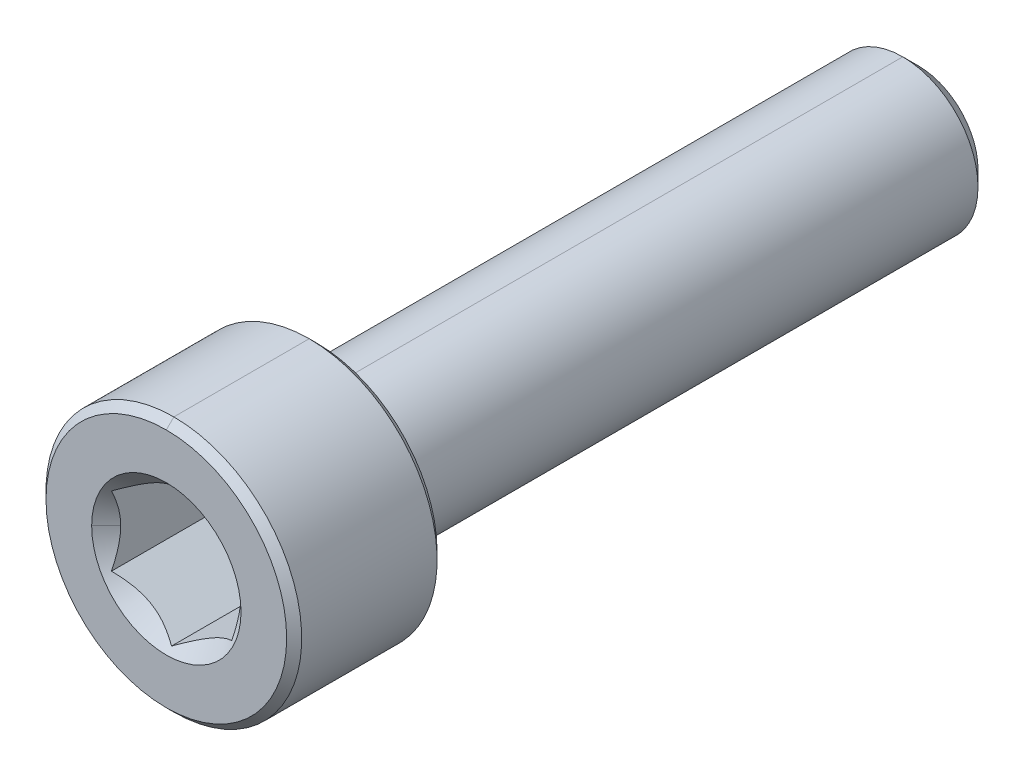
ISO-10303-21;
HEADER;
FILE_DESCRIPTION(('STEP AP214'),'2;1');
FILE_NAME('part.step','',(''),(''),'','','');
FILE_SCHEMA(('AUTOMOTIVE_DESIGN { 1 0 10303 214 1 1 1 1 }'));
ENDSEC;
DATA;
#1=APPLICATION_CONTEXT('core data for automotive mechanical design processes');
#2=APPLICATION_PROTOCOL_DEFINITION('international standard','automotive_design',2000,#1);
#3=PRODUCT_CONTEXT('',#1,'mechanical');
#4=PRODUCT('Part','Part','',(#3));
#5=PRODUCT_RELATED_PRODUCT_CATEGORY('part','',(#4));
#6=PRODUCT_DEFINITION_FORMATION('','',#4);
#7=PRODUCT_DEFINITION_CONTEXT('part definition',#1,'design');
#8=PRODUCT_DEFINITION('design','',#6,#7);
#9=PRODUCT_DEFINITION_SHAPE('','',#8);
#10=(LENGTH_UNIT() NAMED_UNIT(*) SI_UNIT(.MILLI.,.METRE.));
#11=(NAMED_UNIT(*) PLANE_ANGLE_UNIT() SI_UNIT($,.RADIAN.));
#12=(NAMED_UNIT(*) SI_UNIT($,.STERADIAN.) SOLID_ANGLE_UNIT());
#13=UNCERTAINTY_MEASURE_WITH_UNIT(LENGTH_MEASURE(1.E-05),#10,'distance_accuracy_value','');
#14=(GEOMETRIC_REPRESENTATION_CONTEXT(3) GLOBAL_UNCERTAINTY_ASSIGNED_CONTEXT((#13)) GLOBAL_UNIT_ASSIGNED_CONTEXT((#10,
#11,#12)) REPRESENTATION_CONTEXT('',''));
#15=CARTESIAN_POINT('',(0.,0.,0.));
#16=DIRECTION('',(0.,0.,1.));
#17=DIRECTION('',(1.,0.,0.));
#18=AXIS2_PLACEMENT_3D('',#15,#16,#17);
#19=CARTESIAN_POINT('',(2.,-1.15470053837925,1.38989907339221));
#20=DIRECTION('',(1.,0.,0.));
#21=DIRECTION('',(0.,1.,0.));
#22=AXIS2_PLACEMENT_3D('',#19,#20,#21);
#23=PLANE('',#22);
#24=DIRECTION('',(0.,0.,1.));
#25=VECTOR('',#24,1.);
#26=CARTESIAN_POINT('',(2.,-1.15470053837925,1.38989907339221));
#27=LINE('',#26,#25);
#28=CARTESIAN_POINT('',(2.,-1.15470053837925,8.5));
#29=VERTEX_POINT('',#28);
#30=CARTESIAN_POINT('',(2.,-1.15470053837925,12.3267949192431));
#31=VERTEX_POINT('',#30);
#32=EDGE_CURVE('E279',#29,#31,#27,.T.);
#33=ORIENTED_EDGE('',*,*,#32,.T.);
#34=CARTESIAN_POINT('',(2.,-1.15470053837925,12.3267949192431));
#35=CARTESIAN_POINT('',(2.,-0.860711468066337,12.1798003840866));
#36=CARTESIAN_POINT('',(2.,-0.594553501558203,12.1038966261432));
#37=CARTESIAN_POINT('',(2.,-0.291229850402118,12.0173938424846));
#38=CARTESIAN_POINT('',(2.,0.,12.0173938424846));
#39=B_SPLINE_CURVE_WITH_KNOTS('',2,(#34,#35,#36,#37,#38),.UNSPECIFIED.,.F.,.F.,(3,2,3),(0.,0.5,
1.),.UNSPECIFIED.);
#40=CARTESIAN_POINT('',(2.,0.,12.0173938424846));
#41=VERTEX_POINT('',#40);
#42=EDGE_CURVE('E332',#31,#41,#39,.T.);
#43=ORIENTED_EDGE('',*,*,#42,.T.);
#44=CARTESIAN_POINT('',(2.,0.,12.0173938424846));
#45=CARTESIAN_POINT('',(2.,0.2906347536431,12.0173938424846));
#46=CARTESIAN_POINT('',(2.,0.59433789161311,12.1038351978567));
#47=CARTESIAN_POINT('',(2.,0.860020865665505,12.1794550828862));
#48=CARTESIAN_POINT('',(2.,1.15470053837926,12.3267949192431));
#49=B_SPLINE_CURVE_WITH_KNOTS('',2,(#44,#45,#46,#47,#48),.UNSPECIFIED.,.F.,.F.,(3,2,3),(0.,0.5,
1.),.UNSPECIFIED.);
#50=CARTESIAN_POINT('',(2.,1.15470053837925,12.3267949192431));
#51=VERTEX_POINT('',#50);
#52=EDGE_CURVE('E342',#41,#51,#49,.T.);
#53=ORIENTED_EDGE('',*,*,#52,.T.);
#54=DIRECTION('',(0.,0.,1.));
#55=VECTOR('',#54,1.);
#56=CARTESIAN_POINT('',(2.,1.15470053837925,1.38989907339221));
#57=LINE('',#56,#55);
#58=CARTESIAN_POINT('',(2.,1.15470053837925,8.5));
#59=VERTEX_POINT('',#58);
#60=EDGE_CURVE('E10',#59,#51,#57,.T.);
#61=ORIENTED_EDGE('',*,*,#60,.F.);
#62=DIRECTION('',(0.,1.,0.));
#63=VECTOR('',#62,1.);
#64=CARTESIAN_POINT('',(2.,-1.15470053837925,8.5));
#65=LINE('',#64,#63);
#66=EDGE_CURVE('E336',#29,#59,#65,.T.);
#67=ORIENTED_EDGE('',*,*,#66,.F.);
#68=EDGE_LOOP('',(#33,#43,#53,#61,#67));
#69=FACE_BOUND('',#68,.T.);
#70=ADVANCED_FACE('F16',(#69),#23,.F.);
#71=CARTESIAN_POINT('',(2.,1.15470053837925,1.38989907339221));
#72=DIRECTION('',(0.5,0.866025403784439,0.));
#73=DIRECTION('',(0.,0.,-1.));
#74=AXIS2_PLACEMENT_3D('',#71,#72,#73);
#75=PLANE('',#74);
#76=ORIENTED_EDGE('',*,*,#60,.T.);
#77=CARTESIAN_POINT('',(2.,1.15470053837925,12.3267949192431));
#78=CARTESIAN_POINT('',(1.74731844122738,1.30058630435588,12.1809091532665));
#79=CARTESIAN_POINT('',(1.51844238813641,1.43272795521901,12.1050663933784));
#80=CARTESIAN_POINT('',(1.2559956895848,1.58425162727571,12.0180993137174));
#81=CARTESIAN_POINT('',(1.00368304019056,1.72992440332342,12.0173983640745));
#82=CARTESIAN_POINT('',(0.75182144825299,1.87533676122711,12.016698667514));
#83=CARTESIAN_POINT('',(0.488251463553495,2.02750896284366,12.1028631148724));
#84=CARTESIAN_POINT('',(0.256815050186904,2.16112883840115,12.178522680885));
#85=CARTESIAN_POINT('',(0.,2.3094010767585,12.3267949192431));
#86=B_SPLINE_CURVE_WITH_KNOTS('',2,(#77,#78,#79,#80,#81,#82,#83,#84,#85),.UNSPECIFIED.,.F.,.F.,
(3,2,2,2,3),(0.,0.25,0.5,0.75,1.),.UNSPECIFIED.);
#87=CARTESIAN_POINT('',(0.,2.30940107675851,12.3267949192431));
#88=VERTEX_POINT('',#87);
#89=EDGE_CURVE('E352',#51,#88,#86,.T.);
#90=ORIENTED_EDGE('',*,*,#89,.T.);
#91=DIRECTION('',(0.,0.,1.));
#92=VECTOR('',#91,1.);
#93=CARTESIAN_POINT('',(0.,2.30940107675851,1.38989907339221));
#94=LINE('',#93,#92);
#95=CARTESIAN_POINT('',(0.,2.30940107675851,8.5));
#96=VERTEX_POINT('',#95);
#97=EDGE_CURVE('E28',#96,#88,#94,.T.);
#98=ORIENTED_EDGE('',*,*,#97,.F.);
#99=DIRECTION('',(-0.866025403784439,0.5,0.));
#100=VECTOR('',#99,1.);
#101=CARTESIAN_POINT('',(2.,1.15470053837925,8.5));
#102=LINE('',#101,#100);
#103=EDGE_CURVE('E349',#59,#96,#102,.T.);
#104=ORIENTED_EDGE('',*,*,#103,.F.);
#105=EDGE_LOOP('',(#76,#90,#98,#104));
#106=FACE_BOUND('',#105,.T.);
#107=ADVANCED_FACE('F323',(#106),#75,.F.);
#108=CARTESIAN_POINT('',(0.,2.30940107675851,1.38989907339221));
#109=DIRECTION('',(-0.5,0.866025403784439,0.));
#110=DIRECTION('',(0.,0.,1.));
#111=AXIS2_PLACEMENT_3D('',#108,#109,#110);
#112=PLANE('',#111);
#113=ORIENTED_EDGE('',*,*,#97,.T.);
#114=CARTESIAN_POINT('',(0.,2.30940107675851,12.3267949192431));
#115=CARTESIAN_POINT('',(-0.252681558774491,2.1635153107808,12.1809091532654));
#116=CARTESIAN_POINT('',(-0.481557611863588,2.03137365991875,12.1050663933784));
#117=CARTESIAN_POINT('',(-0.744004310419591,1.87984998785951,12.0180993137164));
#118=CARTESIAN_POINT('',(-0.996316959809438,1.73417721181434,12.0173983640745));
#119=CARTESIAN_POINT('',(-1.24817855175139,1.58876485390813,12.016698667515));
#120=CARTESIAN_POINT('',(-1.51174853644651,1.43659265229409,12.1028631148724));
#121=CARTESIAN_POINT('',(-1.74318494981484,1.3029727767356,12.1785226808861));
#122=CARTESIAN_POINT('',(-2.,1.15470053837925,12.3267949192431));
#123=B_SPLINE_CURVE_WITH_KNOTS('',2,(#114,#115,#116,#117,#118,#119,#120,#121,#122),
.UNSPECIFIED.,.F.,.F.,(3,2,2,2,3),(0.,0.25,0.5,0.75,1.),.UNSPECIFIED.);
#124=CARTESIAN_POINT('',(-2.,1.15470053837925,12.3267949192431));
#125=VERTEX_POINT('',#124);
#126=EDGE_CURVE('E184',#88,#125,#123,.T.);
#127=ORIENTED_EDGE('',*,*,#126,.T.);
#128=DIRECTION('',(0.,0.,1.));
#129=VECTOR('',#128,1.);
#130=CARTESIAN_POINT('',(-2.,1.15470053837925,1.38989907339221));
#131=LINE('',#130,#129);
#132=CARTESIAN_POINT('',(-2.,1.15470053837925,8.5));
#133=VERTEX_POINT('',#132);
#134=EDGE_CURVE('E53',#133,#125,#131,.T.);
#135=ORIENTED_EDGE('',*,*,#134,.F.);
#136=DIRECTION('',(-0.866025403784439,-0.5,0.));
#137=VECTOR('',#136,1.);
#138=CARTESIAN_POINT('',(0.,2.30940107675851,8.5));
#139=LINE('',#138,#137);
#140=EDGE_CURVE('E402',#96,#133,#139,.T.);
#141=ORIENTED_EDGE('',*,*,#140,.F.);
#142=EDGE_LOOP('',(#113,#127,#135,#141));
#143=FACE_BOUND('',#142,.T.);
#144=ADVANCED_FACE('F220',(#143),#112,.F.);
#145=CARTESIAN_POINT('',(-2.,1.15470053837925,1.38989907339221));
#146=DIRECTION('',(-1.,0.,0.));
#147=DIRECTION('',(0.,1.,0.));
#148=AXIS2_PLACEMENT_3D('',#145,#146,#147);
#149=PLANE('',#148);
#150=ORIENTED_EDGE('',*,*,#134,.T.);
#151=CARTESIAN_POINT('',(-2.,1.15470053837925,12.3267949192431));
#152=CARTESIAN_POINT('',(-2.,0.860594448234704,12.1797418741708));
#153=CARTESIAN_POINT('',(-2.,0.594337891613108,12.1038351978567));
#154=CARTESIAN_POINT('',(-2.,0.29112902055344,12.0173938424846));
#155=CARTESIAN_POINT('',(-2.,0.,12.0173938424846));
#156=B_SPLINE_CURVE_WITH_KNOTS('',2,(#151,#152,#153,#154,#155),.UNSPECIFIED.,.F.,.F.,(3,2,3),
(0.,0.5,1.),.UNSPECIFIED.);
#157=CARTESIAN_POINT('',(-2.,0.,12.0173938424846));
#158=VERTEX_POINT('',#157);
#159=EDGE_CURVE('E173',#125,#158,#156,.T.);
#160=ORIENTED_EDGE('',*,*,#159,.T.);
#161=CARTESIAN_POINT('',(-2.,0.,12.0173938424846));
#162=CARTESIAN_POINT('',(-2.,-0.290734141218018,12.0173938424846));
#163=CARTESIAN_POINT('',(-2.,-0.594553501558203,12.1038966261432));
#164=CARTESIAN_POINT('',(-2.,-0.860136204723693,12.1795127524153));
#165=CARTESIAN_POINT('',(-2.,-1.15470053837925,12.3267949192431));
#166=B_SPLINE_CURVE_WITH_KNOTS('',2,(#161,#162,#163,#164,#165),.UNSPECIFIED.,.F.,.F.,(3,2,3),
(0.,0.5,1.),.UNSPECIFIED.);
#167=CARTESIAN_POINT('',(-2.,-1.15470053837925,12.3267949192431));
#168=VERTEX_POINT('',#167);
#169=EDGE_CURVE('E178',#158,#168,#166,.T.);
#170=ORIENTED_EDGE('',*,*,#169,.T.);
#171=DIRECTION('',(0.,0.,1.));
#172=VECTOR('',#171,1.);
#173=CARTESIAN_POINT('',(-2.,-1.15470053837925,1.38989907339221));
#174=LINE('',#173,#172);
#175=CARTESIAN_POINT('',(-2.,-1.15470053837925,8.5));
#176=VERTEX_POINT('',#175);
#177=EDGE_CURVE('E42',#176,#168,#174,.T.);
#178=ORIENTED_EDGE('',*,*,#177,.F.);
#179=DIRECTION('',(0.,-1.,0.));
#180=VECTOR('',#179,1.);
#181=CARTESIAN_POINT('',(-2.,1.15470053837925,8.5));
#182=LINE('',#181,#180);
#183=EDGE_CURVE('E406',#133,#176,#182,.T.);
#184=ORIENTED_EDGE('',*,*,#183,.F.);
#185=EDGE_LOOP('',(#150,#160,#170,#178,#184));
#186=FACE_BOUND('',#185,.T.);
#187=ADVANCED_FACE('F176',(#186),#149,.F.);
#188=CARTESIAN_POINT('',(-2.,-1.15470053837925,1.38989907339221));
#189=DIRECTION('',(-0.5,-0.866025403784439,0.));
#190=DIRECTION('',(-0.866025403784439,0.5,0.));
#191=AXIS2_PLACEMENT_3D('',#188,#189,#190);
#192=PLANE('',#191);
#193=ORIENTED_EDGE('',*,*,#177,.T.);
#194=CARTESIAN_POINT('',(-2.,-1.15470053837925,12.3267949192431));
#195=CARTESIAN_POINT('',(-1.7473184412223,-1.30058630435881,12.1809091532636));
#196=CARTESIAN_POINT('',(-1.51844238813641,-1.43272795521901,12.1050663933784));
#197=CARTESIAN_POINT('',(-1.25599568958183,-1.58425162727742,12.0180993137178));
#198=CARTESIAN_POINT('',(-1.00368304019056,-1.72992440332342,12.0173983640745));
#199=CARTESIAN_POINT('',(-0.751821448254411,-1.87533676122629,12.0166986675136));
#200=CARTESIAN_POINT('',(-0.488251463553495,-2.02750896284366,12.1028631148724));
#201=CARTESIAN_POINT('',(-0.256815050186904,-2.16112883840115,12.178522680885));
#202=CARTESIAN_POINT('',(0.,-2.3094010767585,12.3267949192431));
#203=B_SPLINE_CURVE_WITH_KNOTS('',2,(#194,#195,#196,#197,#198,#199,#200,#201,#202),
.UNSPECIFIED.,.F.,.F.,(3,2,2,2,3),(0.,0.25,0.5,0.75,1.),.UNSPECIFIED.);
#204=CARTESIAN_POINT('',(0.,-2.30940107675851,12.3267949192431));
#205=VERTEX_POINT('',#204);
#206=EDGE_CURVE('E202',#168,#205,#203,.T.);
#207=ORIENTED_EDGE('',*,*,#206,.T.);
#208=DIRECTION('',(0.,0.,1.));
#209=VECTOR('',#208,1.);
#210=CARTESIAN_POINT('',(0.,-2.30940107675851,1.38989907339221));
#211=LINE('',#210,#209);
#212=CARTESIAN_POINT('',(0.,-2.30940107675851,8.5));
#213=VERTEX_POINT('',#212);
#214=EDGE_CURVE('E286',#213,#205,#211,.T.);
#215=ORIENTED_EDGE('',*,*,#214,.F.);
#216=DIRECTION('',(0.866025403784439,-0.5,0.));
#217=VECTOR('',#216,1.);
#218=CARTESIAN_POINT('',(-2.,-1.15470053837925,8.5));
#219=LINE('',#218,#217);
#220=EDGE_CURVE('E296',#176,#213,#219,.T.);
#221=ORIENTED_EDGE('',*,*,#220,.F.);
#222=EDGE_LOOP('',(#193,#207,#215,#221));
#223=FACE_BOUND('',#222,.T.);
#224=ADVANCED_FACE('F219',(#223),#192,.F.);
#225=CARTESIAN_POINT('',(0.,-2.30940107675851,1.38989907339221));
#226=DIRECTION('',(0.5,-0.866025403784439,0.));
#227=DIRECTION('',(0.,0.,-1.));
#228=AXIS2_PLACEMENT_3D('',#225,#226,#227);
#229=PLANE('',#228);
#230=ORIENTED_EDGE('',*,*,#214,.T.);
#231=CARTESIAN_POINT('',(0.,-2.30940107675851,12.3267949192431));
#232=CARTESIAN_POINT('',(0.252681558774368,-2.16351531078087,12.1809091532655));
#233=CARTESIAN_POINT('',(0.481557611863587,-2.03137365991875,12.1050663933784));
#234=CARTESIAN_POINT('',(0.744004310419528,-1.87984998785955,12.0180993137164));
#235=CARTESIAN_POINT('',(0.996316959809436,-1.73417721181434,12.0173983640745));
#236=CARTESIAN_POINT('',(1.24817855175601,-1.58876485390546,12.0166986675149));
#237=CARTESIAN_POINT('',(1.51174853644651,-1.43659265229409,12.1028631148724));
#238=CARTESIAN_POINT('',(1.74318494982025,-1.30297277673248,12.1785226808892));
#239=CARTESIAN_POINT('',(2.,-1.15470053837925,12.3267949192431));
#240=B_SPLINE_CURVE_WITH_KNOTS('',2,(#231,#232,#233,#234,#235,#236,#237,#238,#239),
.UNSPECIFIED.,.F.,.F.,(3,2,2,2,3),(0.,0.25,0.5,0.75,1.),.UNSPECIFIED.);
#241=EDGE_CURVE('E302',#205,#31,#240,.T.);
#242=ORIENTED_EDGE('',*,*,#241,.T.);
#243=ORIENTED_EDGE('',*,*,#32,.F.);
#244=DIRECTION('',(0.866025403784439,0.5,0.));
#245=VECTOR('',#244,1.);
#246=CARTESIAN_POINT('',(0.,-2.30940107675851,8.5));
#247=LINE('',#246,#245);
#248=EDGE_CURVE('E339',#213,#29,#247,.T.);
#249=ORIENTED_EDGE('',*,*,#248,.F.);
#250=EDGE_LOOP('',(#230,#242,#243,#249));
#251=FACE_BOUND('',#250,.T.);
#252=ADVANCED_FACE('F308',(#251),#229,.F.);
#253=CARTESIAN_POINT('',(0.,4.,8.5));
#254=DIRECTION('',(0.,0.,-1.));
#255=DIRECTION('',(-1.,0.,0.));
#256=AXIS2_PLACEMENT_3D('',#253,#254,#255);
#257=PLANE('',#256);
#258=ORIENTED_EDGE('',*,*,#248,.T.);
#259=ORIENTED_EDGE('',*,*,#66,.T.);
#260=ORIENTED_EDGE('',*,*,#103,.T.);
#261=ORIENTED_EDGE('',*,*,#140,.T.);
#262=ORIENTED_EDGE('',*,*,#183,.T.);
#263=ORIENTED_EDGE('',*,*,#220,.T.);
#264=EDGE_LOOP('',(#258,#259,#260,#261,#262,#263));
#265=FACE_BOUND('',#264,.T.);
#266=ADVANCED_FACE('F247',(#265),#257,.F.);
#267=CARTESIAN_POINT('',(0.,0.,12.5));
#268=DIRECTION('',(0.,0.,1.));
#269=DIRECTION('',(1.,0.,0.));
#270=AXIS2_PLACEMENT_3D('',#267,#268,#269);
#271=CONICAL_SURFACE('',#270,2.48260615751539,0.78539816339745);
#272=DIRECTION('',(-0.707106781186549,0.,0.707106781186546));
#273=VECTOR('',#272,1.);
#274=CARTESIAN_POINT('',(-2.48260615751539,0.,12.5));
#275=LINE('',#274,#273);
#276=CARTESIAN_POINT('',(-2.48260615751539,0.,12.5));
#277=VERTEX_POINT('',#276);
#278=EDGE_CURVE('E189',#158,#277,#275,.T.);
#279=ORIENTED_EDGE('',*,*,#278,.F.);
#280=ORIENTED_EDGE('',*,*,#159,.F.);
#281=ORIENTED_EDGE('',*,*,#126,.F.);
#282=ORIENTED_EDGE('',*,*,#89,.F.);
#283=ORIENTED_EDGE('',*,*,#52,.F.);
#284=DIRECTION('',(0.707106781186549,0.,0.707106781186546));
#285=VECTOR('',#284,1.);
#286=CARTESIAN_POINT('',(2.48260615751539,0.,12.5));
#287=LINE('',#286,#285);
#288=CARTESIAN_POINT('',(2.48260615751539,0.,12.5));
#289=VERTEX_POINT('',#288);
#290=EDGE_CURVE('E453',#41,#289,#287,.T.);
#291=ORIENTED_EDGE('',*,*,#290,.T.);
#292=CARTESIAN_POINT('',(0.,0.,12.5));
#293=DIRECTION('',(0.,0.,1.));
#294=DIRECTION('',(1.,0.,0.));
#295=AXIS2_PLACEMENT_3D('',#292,#293,#294);
#296=CIRCLE('',#295,2.48260615751539);
#297=EDGE_CURVE('E185',#289,#277,#296,.T.);
#298=ORIENTED_EDGE('',*,*,#297,.T.);
#299=EDGE_LOOP('',(#279,#280,#281,#282,#283,#291,#298));
#300=FACE_BOUND('',#299,.T.);
#301=ADVANCED_FACE('F190',(#300),#271,.F.);
#302=CARTESIAN_POINT('',(0.,0.,12.5));
#303=DIRECTION('',(0.,0.,1.));
#304=DIRECTION('',(0.,-1.,0.));
#305=AXIS2_PLACEMENT_3D('',#302,#303,#304);
#306=PLANE('',#305);
#307=ORIENTED_EDGE('',*,*,#297,.F.);
#308=CARTESIAN_POINT('',(0.,0.,12.5));
#309=DIRECTION('',(0.,0.,1.));
#310=DIRECTION('',(1.,0.,0.));
#311=AXIS2_PLACEMENT_3D('',#308,#309,#310);
#312=CIRCLE('',#311,2.48260615751539);
#313=EDGE_CURVE('E196',#277,#289,#312,.T.);
#314=ORIENTED_EDGE('',*,*,#313,.F.);
#315=EDGE_LOOP('',(#307,#314));
#316=FACE_BOUND('',#315,.T.);
#317=CARTESIAN_POINT('',(0.,0.,12.5));
#318=DIRECTION('',(0.,0.,-1.));
#319=DIRECTION('',(0.,1.,0.));
#320=AXIS2_PLACEMENT_3D('',#317,#318,#319);
#321=CIRCLE('',#320,4.);
#322=CARTESIAN_POINT('',(0.,4.,12.5));
#323=VERTEX_POINT('',#322);
#324=CARTESIAN_POINT('',(0.,-4.,12.5));
#325=VERTEX_POINT('',#324);
#326=EDGE_CURVE('E490',#323,#325,#321,.T.);
#327=ORIENTED_EDGE('',*,*,#326,.F.);
#328=CARTESIAN_POINT('',(0.,0.,12.5));
#329=DIRECTION('',(0.,0.,-1.));
#330=DIRECTION('',(0.,1.,0.));
#331=AXIS2_PLACEMENT_3D('',#328,#329,#330);
#332=CIRCLE('',#331,4.);
#333=EDGE_CURVE('E432',#325,#323,#332,.T.);
#334=ORIENTED_EDGE('',*,*,#333,.F.);
#335=EDGE_LOOP('',(#327,#334));
#336=FACE_BOUND('',#335,.T.);
#337=ADVANCED_FACE('F246',(#316,#336),#306,.T.);
#338=CARTESIAN_POINT('',(0.,0.,12.25));
#339=DIRECTION('',(0.,0.,-1.));
#340=DIRECTION('',(0.,1.,0.));
#341=AXIS2_PLACEMENT_3D('',#338,#339,#340);
#342=CONICAL_SURFACE('',#341,4.25,0.785398163397448);
#343=DIRECTION('',(0.,-0.707106781186548,-0.707106781186548));
#344=VECTOR('',#343,1.);
#345=CARTESIAN_POINT('',(0.,-4.25,12.25));
#346=LINE('',#345,#344);
#347=CARTESIAN_POINT('',(0.,-4.25,12.25));
#348=VERTEX_POINT('',#347);
#349=EDGE_CURVE('E485',#325,#348,#346,.T.);
#350=ORIENTED_EDGE('',*,*,#349,.F.);
#351=ORIENTED_EDGE('',*,*,#333,.T.);
#352=DIRECTION('',(0.,0.707106781186548,-0.707106781186548));
#353=VECTOR('',#352,1.);
#354=CARTESIAN_POINT('',(0.,4.25,12.25));
#355=LINE('',#354,#353);
#356=CARTESIAN_POINT('',(0.,4.25,12.25));
#357=VERTEX_POINT('',#356);
#358=EDGE_CURVE('E355',#323,#357,#355,.T.);
#359=ORIENTED_EDGE('',*,*,#358,.T.);
#360=CARTESIAN_POINT('',(0.,0.,12.25));
#361=DIRECTION('',(0.,0.,-1.));
#362=DIRECTION('',(0.,1.,0.));
#363=AXIS2_PLACEMENT_3D('',#360,#361,#362);
#364=CIRCLE('',#363,4.25);
#365=EDGE_CURVE('E429',#348,#357,#364,.T.);
#366=ORIENTED_EDGE('',*,*,#365,.F.);
#367=EDGE_LOOP('',(#350,#351,#359,#366));
#368=FACE_BOUND('',#367,.T.);
#369=ADVANCED_FACE('F514',(#368),#342,.T.);
#370=CARTESIAN_POINT('',(0.,0.,-12.5));
#371=DIRECTION('',(0.,0.,-1.));
#372=DIRECTION('',(0.,1.,0.));
#373=AXIS2_PLACEMENT_3D('',#370,#371,#372);
#374=CYLINDRICAL_SURFACE('',#373,4.25);
#375=DIRECTION('',(0.,0.,-1.));
#376=VECTOR('',#375,1.);
#377=CARTESIAN_POINT('',(0.,-4.25,-12.5));
#378=LINE('',#377,#376);
#379=CARTESIAN_POINT('',(0.,-4.25,7.75));
#380=VERTEX_POINT('',#379);
#381=EDGE_CURVE('E357',#348,#380,#378,.T.);
#382=ORIENTED_EDGE('',*,*,#381,.F.);
#383=ORIENTED_EDGE('',*,*,#365,.T.);
#384=DIRECTION('',(0.,0.,-1.));
#385=VECTOR('',#384,1.);
#386=CARTESIAN_POINT('',(0.,4.25,-12.5));
#387=LINE('',#386,#385);
#388=CARTESIAN_POINT('',(0.,4.25,7.75));
#389=VERTEX_POINT('',#388);
#390=EDGE_CURVE('E366',#357,#389,#387,.T.);
#391=ORIENTED_EDGE('',*,*,#390,.T.);
#392=CARTESIAN_POINT('',(0.,0.,7.75));
#393=DIRECTION('',(0.,0.,-1.));
#394=DIRECTION('',(0.,1.,0.));
#395=AXIS2_PLACEMENT_3D('',#392,#393,#394);
#396=CIRCLE('',#395,4.25);
#397=EDGE_CURVE('E426',#380,#389,#396,.T.);
#398=ORIENTED_EDGE('',*,*,#397,.F.);
#399=EDGE_LOOP('',(#382,#383,#391,#398));
#400=FACE_BOUND('',#399,.T.);
#401=ADVANCED_FACE('F525',(#400),#374,.T.);
#402=CARTESIAN_POINT('',(0.,0.,7.5));
#403=DIRECTION('',(0.,0.,1.));
#404=DIRECTION('',(0.,-1.,0.));
#405=AXIS2_PLACEMENT_3D('',#402,#403,#404);
#406=CONICAL_SURFACE('',#405,4.,0.785398163397448);
#407=DIRECTION('',(0.,0.707106781186548,0.707106781186548));
#408=VECTOR('',#407,1.);
#409=CARTESIAN_POINT('',(0.,4.,7.5));
#410=LINE('',#409,#408);
#411=CARTESIAN_POINT('',(0.,4.,7.5));
#412=VERTEX_POINT('',#411);
#413=EDGE_CURVE('E365',#412,#389,#410,.T.);
#414=ORIENTED_EDGE('',*,*,#413,.F.);
#415=CARTESIAN_POINT('',(0.,0.,7.5));
#416=DIRECTION('',(0.,0.,-1.));
#417=DIRECTION('',(0.,1.,0.));
#418=AXIS2_PLACEMENT_3D('',#415,#416,#417);
#419=CIRCLE('',#418,4.);
#420=CARTESIAN_POINT('',(0.,-4.,7.5));
#421=VERTEX_POINT('',#420);
#422=EDGE_CURVE('E423',#421,#412,#419,.T.);
#423=ORIENTED_EDGE('',*,*,#422,.F.);
#424=DIRECTION('',(0.,-0.707106781186548,0.707106781186548));
#425=VECTOR('',#424,1.);
#426=CARTESIAN_POINT('',(0.,-4.,7.5));
#427=LINE('',#426,#425);
#428=EDGE_CURVE('E367',#421,#380,#427,.T.);
#429=ORIENTED_EDGE('',*,*,#428,.T.);
#430=ORIENTED_EDGE('',*,*,#397,.T.);
#431=EDGE_LOOP('',(#414,#423,#429,#430));
#432=FACE_BOUND('',#431,.T.);
#433=ADVANCED_FACE('F529',(#432),#406,.T.);
#434=CARTESIAN_POINT('',(0.,4.,7.5));
#435=DIRECTION('',(0.,0.,-1.));
#436=DIRECTION('',(-1.,0.,0.));
#437=AXIS2_PLACEMENT_3D('',#434,#435,#436);
#438=PLANE('',#437);
#439=CARTESIAN_POINT('',(0.,0.,7.5));
#440=DIRECTION('',(0.,0.,-1.));
#441=DIRECTION('',(0.,1.,0.));
#442=AXIS2_PLACEMENT_3D('',#439,#440,#441);
#443=CIRCLE('',#442,2.75);
#444=CARTESIAN_POINT('',(0.,2.75,7.5));
#445=VERTEX_POINT('',#444);
#446=CARTESIAN_POINT('',(0.,-2.75,7.5));
#447=VERTEX_POINT('',#446);
#448=EDGE_CURVE('E420',#445,#447,#443,.T.);
#449=ORIENTED_EDGE('',*,*,#448,.F.);
#450=CARTESIAN_POINT('',(0.,0.,7.5));
#451=DIRECTION('',(0.,0.,-1.));
#452=DIRECTION('',(0.,1.,0.));
#453=AXIS2_PLACEMENT_3D('',#450,#451,#452);
#454=CIRCLE('',#453,2.75);
#455=EDGE_CURVE('E385',#447,#445,#454,.T.);
#456=ORIENTED_EDGE('',*,*,#455,.F.);
#457=EDGE_LOOP('',(#449,#456));
#458=FACE_BOUND('',#457,.T.);
#459=ORIENTED_EDGE('',*,*,#422,.T.);
#460=CARTESIAN_POINT('',(0.,0.,7.5));
#461=DIRECTION('',(0.,0.,-1.));
#462=DIRECTION('',(0.,1.,0.));
#463=AXIS2_PLACEMENT_3D('',#460,#461,#462);
#464=CIRCLE('',#463,4.);
#465=EDGE_CURVE('E361',#412,#421,#464,.T.);
#466=ORIENTED_EDGE('',*,*,#465,.T.);
#467=EDGE_LOOP('',(#459,#466));
#468=FACE_BOUND('',#467,.T.);
#469=ADVANCED_FACE('F535',(#458,#468),#438,.T.);
#470=CARTESIAN_POINT('',(0.,0.,7.25));
#471=DIRECTION('',(0.,0.,-1.));
#472=DIRECTION('',(0.,1.,0.));
#473=AXIS2_PLACEMENT_3D('',#470,#471,#472);
#474=TOROIDAL_SURFACE('',#473,2.75,0.25);
#475=CARTESIAN_POINT('',(0.,-2.75,7.25));
#476=DIRECTION('',(1.,0.,0.));
#477=DIRECTION('',(0.,1.,0.));
#478=AXIS2_PLACEMENT_3D('',#475,#476,#477);
#479=CIRCLE('',#478,0.25);
#480=CARTESIAN_POINT('',(0.,-2.5,7.25));
#481=VERTEX_POINT('',#480);
#482=EDGE_CURVE('E381',#481,#447,#479,.T.);
#483=ORIENTED_EDGE('',*,*,#482,.F.);
#484=CARTESIAN_POINT('',(0.,0.,7.25));
#485=DIRECTION('',(0.,0.,-1.));
#486=DIRECTION('',(0.,1.,0.));
#487=AXIS2_PLACEMENT_3D('',#484,#485,#486);
#488=CIRCLE('',#487,2.5);
#489=CARTESIAN_POINT('',(0.,2.5,7.25));
#490=VERTEX_POINT('',#489);
#491=EDGE_CURVE('E386',#490,#481,#488,.T.);
#492=ORIENTED_EDGE('',*,*,#491,.F.);
#493=CARTESIAN_POINT('',(0.,2.75,7.25));
#494=DIRECTION('',(-1.,0.,0.));
#495=DIRECTION('',(0.,0.,1.));
#496=AXIS2_PLACEMENT_3D('',#493,#494,#495);
#497=CIRCLE('',#496,0.25);
#498=EDGE_CURVE('E391',#490,#445,#497,.T.);
#499=ORIENTED_EDGE('',*,*,#498,.T.);
#500=ORIENTED_EDGE('',*,*,#448,.T.);
#501=EDGE_LOOP('',(#483,#492,#499,#500));
#502=FACE_BOUND('',#501,.T.);
#503=ADVANCED_FACE('F539',(#502),#474,.F.);
#504=CARTESIAN_POINT('',(0.,0.,-12.5));
#505=DIRECTION('',(0.,0.,-1.));
#506=DIRECTION('',(0.,1.,0.));
#507=AXIS2_PLACEMENT_3D('',#504,#505,#506);
#508=CYLINDRICAL_SURFACE('',#507,2.5);
#509=DIRECTION('',(0.,0.,-1.));
#510=VECTOR('',#509,1.);
#511=CARTESIAN_POINT('',(0.,-2.5,-12.5));
#512=LINE('',#511,#510);
#513=CARTESIAN_POINT('',(0.,-2.5,-11.9803847577293));
#514=VERTEX_POINT('',#513);
#515=EDGE_CURVE('E390',#481,#514,#512,.T.);
#516=ORIENTED_EDGE('',*,*,#515,.F.);
#517=CARTESIAN_POINT('',(0.,0.,7.25));
#518=DIRECTION('',(0.,0.,-1.));
#519=DIRECTION('',(0.,1.,0.));
#520=AXIS2_PLACEMENT_3D('',#517,#518,#519);
#521=CIRCLE('',#520,2.5);
#522=EDGE_CURVE('E371',#481,#490,#521,.T.);
#523=ORIENTED_EDGE('',*,*,#522,.T.);
#524=DIRECTION('',(0.,0.,-1.));
#525=VECTOR('',#524,1.);
#526=CARTESIAN_POINT('',(0.,2.5,-12.5));
#527=LINE('',#526,#525);
#528=CARTESIAN_POINT('',(0.,2.5,-11.9803847577293));
#529=VERTEX_POINT('',#528);
#530=EDGE_CURVE('E377',#490,#529,#527,.T.);
#531=ORIENTED_EDGE('',*,*,#530,.T.);
#532=CARTESIAN_POINT('',(0.,0.,-11.9803847577293));
#533=DIRECTION('',(0.,0.,-1.));
#534=DIRECTION('',(0.,1.,0.));
#535=AXIS2_PLACEMENT_3D('',#532,#533,#534);
#536=CIRCLE('',#535,2.5);
#537=EDGE_CURVE('E417',#514,#529,#536,.T.);
#538=ORIENTED_EDGE('',*,*,#537,.F.);
#539=EDGE_LOOP('',(#516,#523,#531,#538));
#540=FACE_BOUND('',#539,.T.);
#541=ADVANCED_FACE('F565',(#540),#508,.T.);
#542=CARTESIAN_POINT('',(0.,0.,-12.5));
#543=DIRECTION('',(0.,0.,1.));
#544=DIRECTION('',(0.,-1.,0.));
#545=AXIS2_PLACEMENT_3D('',#542,#543,#544);
#546=CONICAL_SURFACE('',#545,1.98038475772933,0.785398163397445);
#547=DIRECTION('',(0.,0.707106781186545,0.70710678118655));
#548=VECTOR('',#547,1.);
#549=CARTESIAN_POINT('',(0.,1.98038475772933,-12.5));
#550=LINE('',#549,#548);
#551=CARTESIAN_POINT('',(0.,1.98038475772933,-12.5));
#552=VERTEX_POINT('',#551);
#553=EDGE_CURVE('E376',#552,#529,#550,.T.);
#554=ORIENTED_EDGE('',*,*,#553,.F.);
#555=CARTESIAN_POINT('',(0.,0.,-12.5));
#556=DIRECTION('',(0.,0.,-1.));
#557=DIRECTION('',(0.,1.,0.));
#558=AXIS2_PLACEMENT_3D('',#555,#556,#557);
#559=CIRCLE('',#558,1.98038475772933);
#560=CARTESIAN_POINT('',(0.,-1.98038475772933,-12.5));
#561=VERTEX_POINT('',#560);
#562=EDGE_CURVE('E414',#561,#552,#559,.T.);
#563=ORIENTED_EDGE('',*,*,#562,.F.);
#564=DIRECTION('',(0.,-0.707106781186545,0.70710678118655));
#565=VECTOR('',#564,1.);
#566=CARTESIAN_POINT('',(0.,-1.98038475772933,-12.5));
#567=LINE('',#566,#565);
#568=EDGE_CURVE('E410',#561,#514,#567,.T.);
#569=ORIENTED_EDGE('',*,*,#568,.T.);
#570=ORIENTED_EDGE('',*,*,#537,.T.);
#571=EDGE_LOOP('',(#554,#563,#569,#570));
#572=FACE_BOUND('',#571,.T.);
#573=ADVANCED_FACE('F545',(#572),#546,.T.);
#574=CARTESIAN_POINT('',(0.,1.98038475772933,-12.5));
#575=DIRECTION('',(0.,0.,-1.));
#576=DIRECTION('',(-1.,0.,0.));
#577=AXIS2_PLACEMENT_3D('',#574,#575,#576);
#578=PLANE('',#577);
#579=ORIENTED_EDGE('',*,*,#562,.T.);
#580=CARTESIAN_POINT('',(0.,0.,-12.5));
#581=DIRECTION('',(0.,0.,-1.));
#582=DIRECTION('',(0.,1.,0.));
#583=AXIS2_PLACEMENT_3D('',#580,#581,#582);
#584=CIRCLE('',#583,1.98038475772933);
#585=EDGE_CURVE('E372',#552,#561,#584,.T.);
#586=ORIENTED_EDGE('',*,*,#585,.T.);
#587=EDGE_LOOP('',(#579,#586));
#588=FACE_BOUND('',#587,.T.);
#589=ADVANCED_FACE('F541',(#588),#578,.T.);
#590=CARTESIAN_POINT('',(0.,0.,-12.5));
#591=DIRECTION('',(0.,0.,1.));
#592=DIRECTION('',(0.,-1.,0.));
#593=AXIS2_PLACEMENT_3D('',#590,#591,#592);
#594=CONICAL_SURFACE('',#593,1.98038475772933,0.785398163397445);
#595=ORIENTED_EDGE('',*,*,#585,.F.);
#596=ORIENTED_EDGE('',*,*,#553,.T.);
#597=CARTESIAN_POINT('',(0.,0.,-11.9803847577293));
#598=DIRECTION('',(0.,0.,-1.));
#599=DIRECTION('',(0.,1.,0.));
#600=AXIS2_PLACEMENT_3D('',#597,#598,#599);
#601=CIRCLE('',#600,2.5);
#602=EDGE_CURVE('E395',#529,#514,#601,.T.);
#603=ORIENTED_EDGE('',*,*,#602,.T.);
#604=ORIENTED_EDGE('',*,*,#568,.F.);
#605=EDGE_LOOP('',(#595,#596,#603,#604));
#606=FACE_BOUND('',#605,.T.);
#607=ADVANCED_FACE('F544',(#606),#594,.T.);
#608=CARTESIAN_POINT('',(0.,0.,-12.5));
#609=DIRECTION('',(0.,0.,-1.));
#610=DIRECTION('',(0.,1.,0.));
#611=AXIS2_PLACEMENT_3D('',#608,#609,#610);
#612=CYLINDRICAL_SURFACE('',#611,2.5);
#613=ORIENTED_EDGE('',*,*,#491,.T.);
#614=ORIENTED_EDGE('',*,*,#515,.T.);
#615=ORIENTED_EDGE('',*,*,#602,.F.);
#616=ORIENTED_EDGE('',*,*,#530,.F.);
#617=EDGE_LOOP('',(#613,#614,#615,#616));
#618=FACE_BOUND('',#617,.T.);
#619=ADVANCED_FACE('F547',(#618),#612,.T.);
#620=CARTESIAN_POINT('',(0.,0.,7.25));
#621=DIRECTION('',(0.,0.,-1.));
#622=DIRECTION('',(0.,1.,0.));
#623=AXIS2_PLACEMENT_3D('',#620,#621,#622);
#624=TOROIDAL_SURFACE('',#623,2.75,0.25);
#625=ORIENTED_EDGE('',*,*,#522,.F.);
#626=ORIENTED_EDGE('',*,*,#482,.T.);
#627=ORIENTED_EDGE('',*,*,#455,.T.);
#628=ORIENTED_EDGE('',*,*,#498,.F.);
#629=EDGE_LOOP('',(#625,#626,#627,#628));
#630=FACE_BOUND('',#629,.T.);
#631=ADVANCED_FACE('F549',(#630),#624,.F.);
#632=CARTESIAN_POINT('',(0.,0.,7.5));
#633=DIRECTION('',(0.,0.,1.));
#634=DIRECTION('',(0.,-1.,0.));
#635=AXIS2_PLACEMENT_3D('',#632,#633,#634);
#636=CONICAL_SURFACE('',#635,4.,0.785398163397448);
#637=ORIENTED_EDGE('',*,*,#465,.F.);
#638=ORIENTED_EDGE('',*,*,#413,.T.);
#639=CARTESIAN_POINT('',(0.,0.,7.75));
#640=DIRECTION('',(0.,0.,-1.));
#641=DIRECTION('',(0.,1.,0.));
#642=AXIS2_PLACEMENT_3D('',#639,#640,#641);
#643=CIRCLE('',#642,4.25);
#644=EDGE_CURVE('E360',#389,#380,#643,.T.);
#645=ORIENTED_EDGE('',*,*,#644,.T.);
#646=ORIENTED_EDGE('',*,*,#428,.F.);
#647=EDGE_LOOP('',(#637,#638,#645,#646));
#648=FACE_BOUND('',#647,.T.);
#649=ADVANCED_FACE('F554',(#648),#636,.T.);
#650=CARTESIAN_POINT('',(0.,0.,-12.5));
#651=DIRECTION('',(0.,0.,-1.));
#652=DIRECTION('',(0.,1.,0.));
#653=AXIS2_PLACEMENT_3D('',#650,#651,#652);
#654=CYLINDRICAL_SURFACE('',#653,4.25);
#655=CARTESIAN_POINT('',(0.,0.,12.25));
#656=DIRECTION('',(0.,0.,-1.));
#657=DIRECTION('',(0.,1.,0.));
#658=AXIS2_PLACEMENT_3D('',#655,#656,#657);
#659=CIRCLE('',#658,4.25);
#660=EDGE_CURVE('E489',#357,#348,#659,.T.);
#661=ORIENTED_EDGE('',*,*,#660,.T.);
#662=ORIENTED_EDGE('',*,*,#381,.T.);
#663=ORIENTED_EDGE('',*,*,#644,.F.);
#664=ORIENTED_EDGE('',*,*,#390,.F.);
#665=EDGE_LOOP('',(#661,#662,#663,#664));
#666=FACE_BOUND('',#665,.T.);
#667=ADVANCED_FACE('F561',(#666),#654,.T.);
#668=CARTESIAN_POINT('',(0.,0.,12.25));
#669=DIRECTION('',(0.,0.,-1.));
#670=DIRECTION('',(0.,1.,0.));
#671=AXIS2_PLACEMENT_3D('',#668,#669,#670);
#672=CONICAL_SURFACE('',#671,4.25,0.785398163397448);
#673=ORIENTED_EDGE('',*,*,#326,.T.);
#674=ORIENTED_EDGE('',*,*,#349,.T.);
#675=ORIENTED_EDGE('',*,*,#660,.F.);
#676=ORIENTED_EDGE('',*,*,#358,.F.);
#677=EDGE_LOOP('',(#673,#674,#675,#676));
#678=FACE_BOUND('',#677,.T.);
#679=ADVANCED_FACE('F518',(#678),#672,.T.);
#680=CARTESIAN_POINT('',(0.,0.,12.5));
#681=DIRECTION('',(0.,0.,1.));
#682=DIRECTION('',(1.,0.,0.));
#683=AXIS2_PLACEMENT_3D('',#680,#681,#682);
#684=CONICAL_SURFACE('',#683,2.48260615751539,0.78539816339745);
#685=ORIENTED_EDGE('',*,*,#169,.F.);
#686=ORIENTED_EDGE('',*,*,#278,.T.);
#687=ORIENTED_EDGE('',*,*,#313,.T.);
#688=ORIENTED_EDGE('',*,*,#290,.F.);
#689=ORIENTED_EDGE('',*,*,#42,.F.);
#690=ORIENTED_EDGE('',*,*,#241,.F.);
#691=ORIENTED_EDGE('',*,*,#206,.F.);
#692=EDGE_LOOP('',(#685,#686,#687,#688,#689,#690,#691));
#693=FACE_BOUND('',#692,.T.);
#694=ADVANCED_FACE('F199',(#693),#684,.F.);
#695=CLOSED_SHELL('',(#70,#107,#144,#187,#224,#252,#266,#301,#337,#369,#401,#433,#469,#503,#541,
#573,#589,#607,#619,#631,#649,#667,#679,#694));
#696=MANIFOLD_SOLID_BREP('B1',#695);
#697=ADVANCED_BREP_SHAPE_REPRESENTATION('',(#18,#696),#14);
#698=SHAPE_DEFINITION_REPRESENTATION(#9,#697);
ENDSEC;
END-ISO-10303-21;
